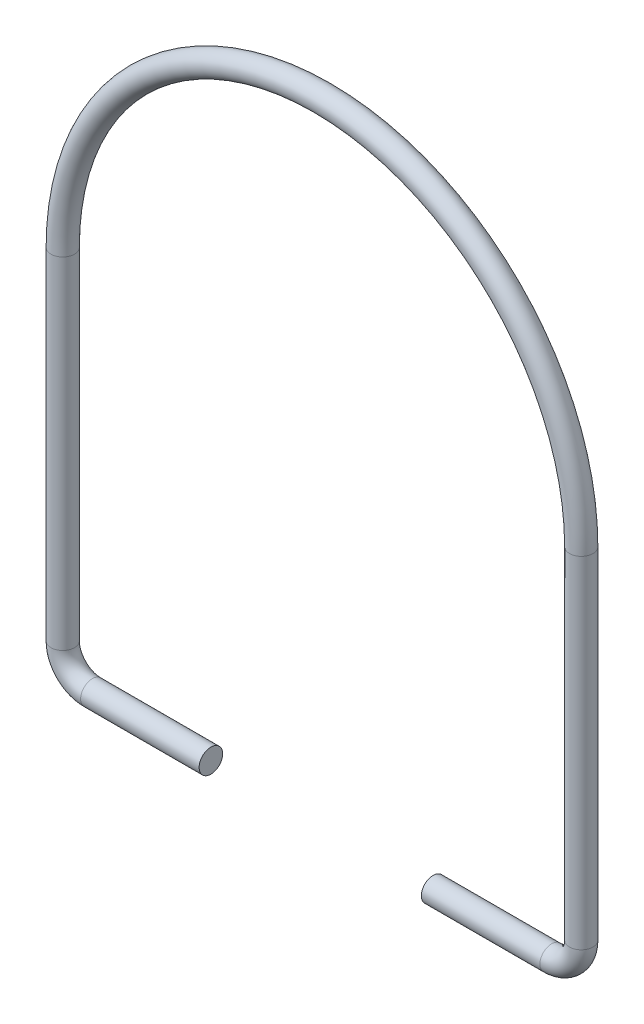
ISO-10303-21;
HEADER;
FILE_DESCRIPTION(('STEP AP214'),'2;1');
FILE_NAME('part.step','',(''),(''),'','','');
FILE_SCHEMA(('AUTOMOTIVE_DESIGN { 1 0 10303 214 1 1 1 1 }'));
ENDSEC;
DATA;
#1=APPLICATION_CONTEXT('core data for automotive mechanical design processes');
#2=APPLICATION_PROTOCOL_DEFINITION('international standard','automotive_design',2000,#1);
#3=PRODUCT_CONTEXT('',#1,'mechanical');
#4=PRODUCT('Part','Part','',(#3));
#5=PRODUCT_RELATED_PRODUCT_CATEGORY('part','',(#4));
#6=PRODUCT_DEFINITION_FORMATION('','',#4);
#7=PRODUCT_DEFINITION_CONTEXT('part definition',#1,'design');
#8=PRODUCT_DEFINITION('design','',#6,#7);
#9=PRODUCT_DEFINITION_SHAPE('','',#8);
#10=(LENGTH_UNIT() NAMED_UNIT(*) SI_UNIT(.MILLI.,.METRE.));
#11=(NAMED_UNIT(*) PLANE_ANGLE_UNIT() SI_UNIT($,.RADIAN.));
#12=(NAMED_UNIT(*) SI_UNIT($,.STERADIAN.) SOLID_ANGLE_UNIT());
#13=UNCERTAINTY_MEASURE_WITH_UNIT(LENGTH_MEASURE(1.E-05),#10,'distance_accuracy_value','');
#14=(GEOMETRIC_REPRESENTATION_CONTEXT(3) GLOBAL_UNCERTAINTY_ASSIGNED_CONTEXT((#13)) GLOBAL_UNIT_ASSIGNED_CONTEXT((#10,
#11,#12)) REPRESENTATION_CONTEXT('',''));
#15=CARTESIAN_POINT('',(0.,0.,0.));
#16=DIRECTION('',(0.,0.,1.));
#17=DIRECTION('',(1.,0.,0.));
#18=AXIS2_PLACEMENT_3D('',#15,#16,#17);
#19=CARTESIAN_POINT('',(46.,0.,0.));
#20=DIRECTION('',(-1.,0.,0.));
#21=DIRECTION('',(0.,-1.,0.));
#22=AXIS2_PLACEMENT_3D('',#19,#20,#21);
#23=CYLINDRICAL_SURFACE('',#22,1.5875);
#24=CARTESIAN_POINT('',(46.,0.,0.));
#25=DIRECTION('',(1.,0.,0.));
#26=DIRECTION('',(0.,0.,-1.));
#27=AXIS2_PLACEMENT_3D('',#24,#25,#26);
#28=CIRCLE('',#27,1.5875);
#29=CARTESIAN_POINT('',(46.,-1.58750000000001,0.));
#30=VERTEX_POINT('',#29);
#31=EDGE_CURVE('E38',#30,#30,#28,.T.);
#32=ORIENTED_EDGE('',*,*,#31,.F.);
#33=EDGE_LOOP('',(#32));
#34=FACE_BOUND('',#33,.T.);
#35=CARTESIAN_POINT('',(30.,0.,0.));
#36=DIRECTION('',(1.,0.,0.));
#37=DIRECTION('',(0.,0.,-1.));
#38=AXIS2_PLACEMENT_3D('',#35,#36,#37);
#39=CIRCLE('',#38,1.5875);
#40=CARTESIAN_POINT('',(30.,0.,-1.5875));
#41=VERTEX_POINT('',#40);
#42=EDGE_CURVE('E10',#41,#41,#39,.T.);
#43=ORIENTED_EDGE('',*,*,#42,.T.);
#44=EDGE_LOOP('',(#43));
#45=FACE_BOUND('',#44,.T.);
#46=ADVANCED_FACE('F32',(#34,#45),#23,.T.);
#47=CARTESIAN_POINT('',(46.,4.,0.));
#48=DIRECTION('',(0.,0.,-1.));
#49=DIRECTION('',(-1.,0.,0.));
#50=AXIS2_PLACEMENT_3D('',#47,#48,#49);
#51=TOROIDAL_SURFACE('',#50,4.00000000000002,1.5875);
#52=CARTESIAN_POINT('',(50.,4.,0.));
#53=DIRECTION('',(0.,1.,0.));
#54=DIRECTION('',(0.,0.,-1.));
#55=AXIS2_PLACEMENT_3D('',#52,#53,#54);
#56=CIRCLE('',#55,1.5875);
#57=CARTESIAN_POINT('',(51.5875,4.,0.));
#58=VERTEX_POINT('',#57);
#59=EDGE_CURVE('E42',#58,#58,#56,.T.);
#60=CARTESIAN_POINT('',(46.,4.,0.));
#61=DIRECTION('',(0.,0.,-1.));
#62=DIRECTION('',(-1.,0.,0.));
#63=AXIS2_PLACEMENT_3D('',#60,#61,#62);
#64=CIRCLE('',#63,5.58750000000002);
#65=EDGE_CURVE('',#58,#30,#64,.T.);
#66=ORIENTED_EDGE('',*,*,#59,.F.);
#67=ORIENTED_EDGE('',*,*,#31,.T.);
#68=ORIENTED_EDGE('',*,*,#65,.T.);
#69=ORIENTED_EDGE('',*,*,#65,.F.);
#70=EDGE_LOOP('',(#66,#68,#67,#69));
#71=FACE_BOUND('',#70,.T.);
#72=ADVANCED_FACE('F88',(#71),#51,.T.);
#73=CARTESIAN_POINT('',(50.,50.,0.));
#74=DIRECTION('',(0.,-1.,0.));
#75=DIRECTION('',(1.,0.,0.));
#76=AXIS2_PLACEMENT_3D('',#73,#74,#75);
#77=CYLINDRICAL_SURFACE('',#76,1.5875);
#78=CARTESIAN_POINT('',(50.,50.,0.));
#79=DIRECTION('',(0.,1.,0.));
#80=DIRECTION('',(0.,0.,-1.));
#81=AXIS2_PLACEMENT_3D('',#78,#79,#80);
#82=CIRCLE('',#81,1.5875);
#83=CARTESIAN_POINT('',(51.5875,50.,0.));
#84=VERTEX_POINT('',#83);
#85=EDGE_CURVE('E46',#84,#84,#82,.T.);
#86=ORIENTED_EDGE('',*,*,#85,.F.);
#87=EDGE_LOOP('',(#86));
#88=FACE_BOUND('',#87,.T.);
#89=ORIENTED_EDGE('',*,*,#59,.T.);
#90=EDGE_LOOP('',(#89));
#91=FACE_BOUND('',#90,.T.);
#92=ADVANCED_FACE('F82',(#88,#91),#77,.T.);
#93=CARTESIAN_POINT('',(15.,50.,0.));
#94=DIRECTION('',(0.,0.,-1.));
#95=DIRECTION('',(-1.,0.,0.));
#96=AXIS2_PLACEMENT_3D('',#93,#94,#95);
#97=TOROIDAL_SURFACE('',#96,35.,1.5875);
#98=CARTESIAN_POINT('',(-20.,50.,0.));
#99=DIRECTION('',(0.,-1.,0.));
#100=DIRECTION('',(0.,0.,-1.));
#101=AXIS2_PLACEMENT_3D('',#98,#99,#100);
#102=CIRCLE('',#101,1.5875);
#103=CARTESIAN_POINT('',(-21.5875,50.,0.));
#104=VERTEX_POINT('',#103);
#105=EDGE_CURVE('E51',#104,#104,#102,.T.);
#106=CARTESIAN_POINT('',(15.,50.,0.));
#107=DIRECTION('',(0.,0.,-1.));
#108=DIRECTION('',(-1.,0.,0.));
#109=AXIS2_PLACEMENT_3D('',#106,#107,#108);
#110=CIRCLE('',#109,36.5875);
#111=EDGE_CURVE('',#104,#84,#110,.T.);
#112=ORIENTED_EDGE('',*,*,#105,.F.);
#113=ORIENTED_EDGE('',*,*,#85,.T.);
#114=ORIENTED_EDGE('',*,*,#111,.T.);
#115=ORIENTED_EDGE('',*,*,#111,.F.);
#116=EDGE_LOOP('',(#112,#114,#113,#115));
#117=FACE_BOUND('',#116,.T.);
#118=ADVANCED_FACE('F76',(#117),#97,.T.);
#119=CARTESIAN_POINT('',(-20.,4.,0.));
#120=DIRECTION('',(0.,1.,0.));
#121=DIRECTION('',(-1.,0.,0.));
#122=AXIS2_PLACEMENT_3D('',#119,#120,#121);
#123=CYLINDRICAL_SURFACE('',#122,1.5875);
#124=CARTESIAN_POINT('',(-20.,4.,0.));
#125=DIRECTION('',(0.,-1.,0.));
#126=DIRECTION('',(0.,0.,-1.));
#127=AXIS2_PLACEMENT_3D('',#124,#125,#126);
#128=CIRCLE('',#127,1.5875);
#129=CARTESIAN_POINT('',(-21.5875,4.,0.));
#130=VERTEX_POINT('',#129);
#131=EDGE_CURVE('E54',#130,#130,#128,.T.);
#132=ORIENTED_EDGE('',*,*,#131,.F.);
#133=EDGE_LOOP('',(#132));
#134=FACE_BOUND('',#133,.T.);
#135=ORIENTED_EDGE('',*,*,#105,.T.);
#136=EDGE_LOOP('',(#135));
#137=FACE_BOUND('',#136,.T.);
#138=ADVANCED_FACE('F70',(#134,#137),#123,.T.);
#139=CARTESIAN_POINT('',(-16.,4.,0.));
#140=DIRECTION('',(0.,0.,-1.));
#141=DIRECTION('',(-1.,0.,0.));
#142=AXIS2_PLACEMENT_3D('',#139,#140,#141);
#143=TOROIDAL_SURFACE('',#142,4.,1.5875);
#144=CARTESIAN_POINT('',(-16.,0.,0.));
#145=DIRECTION('',(1.,0.,0.));
#146=DIRECTION('',(0.,0.,-1.));
#147=AXIS2_PLACEMENT_3D('',#144,#145,#146);
#148=CIRCLE('',#147,1.5875);
#149=CARTESIAN_POINT('',(-16.,-1.5875,0.));
#150=VERTEX_POINT('',#149);
#151=EDGE_CURVE('E57',#150,#150,#148,.T.);
#152=CARTESIAN_POINT('',(-16.,4.,0.));
#153=DIRECTION('',(0.,0.,-1.));
#154=DIRECTION('',(-1.,0.,0.));
#155=AXIS2_PLACEMENT_3D('',#152,#153,#154);
#156=CIRCLE('',#155,5.5875);
#157=EDGE_CURVE('',#150,#130,#156,.T.);
#158=ORIENTED_EDGE('',*,*,#151,.F.);
#159=ORIENTED_EDGE('',*,*,#131,.T.);
#160=ORIENTED_EDGE('',*,*,#157,.T.);
#161=ORIENTED_EDGE('',*,*,#157,.F.);
#162=EDGE_LOOP('',(#158,#160,#159,#161));
#163=FACE_BOUND('',#162,.T.);
#164=ADVANCED_FACE('F67',(#163),#143,.T.);
#165=CARTESIAN_POINT('',(-16.,0.,0.));
#166=DIRECTION('',(1.,0.,0.));
#167=DIRECTION('',(0.,1.,0.));
#168=AXIS2_PLACEMENT_3D('',#165,#166,#167);
#169=CYLINDRICAL_SURFACE('',#168,1.5875);
#170=ORIENTED_EDGE('',*,*,#151,.T.);
#171=EDGE_LOOP('',(#170));
#172=FACE_BOUND('',#171,.T.);
#173=CARTESIAN_POINT('',(0.,0.,0.));
#174=DIRECTION('',(1.,0.,0.));
#175=DIRECTION('',(0.,0.,-1.));
#176=AXIS2_PLACEMENT_3D('',#173,#174,#175);
#177=CIRCLE('',#176,1.5875);
#178=CARTESIAN_POINT('',(0.,0.,-1.5875));
#179=VERTEX_POINT('',#178);
#180=EDGE_CURVE('E58',#179,#179,#177,.T.);
#181=ORIENTED_EDGE('',*,*,#180,.F.);
#182=EDGE_LOOP('',(#181));
#183=FACE_BOUND('',#182,.T.);
#184=ADVANCED_FACE('F64',(#172,#183),#169,.T.);
#185=CARTESIAN_POINT('',(30.,0.,0.));
#186=DIRECTION('',(1.,0.,0.));
#187=DIRECTION('',(0.,0.,-1.));
#188=AXIS2_PLACEMENT_3D('',#185,#186,#187);
#189=PLANE('',#188);
#190=ORIENTED_EDGE('',*,*,#42,.F.);
#191=EDGE_LOOP('',(#190));
#192=FACE_BOUND('',#191,.T.);
#193=ADVANCED_FACE('F100',(#192),#189,.F.);
#194=CARTESIAN_POINT('',(0.,0.,0.));
#195=DIRECTION('',(1.,0.,0.));
#196=DIRECTION('',(0.,0.,-1.));
#197=AXIS2_PLACEMENT_3D('',#194,#195,#196);
#198=PLANE('',#197);
#199=ORIENTED_EDGE('',*,*,#180,.T.);
#200=EDGE_LOOP('',(#199));
#201=FACE_BOUND('',#200,.T.);
#202=ADVANCED_FACE('F101',(#201),#198,.T.);
#203=CLOSED_SHELL('',(#46,#72,#92,#118,#138,#164,#184,#193,#202));
#204=MANIFOLD_SOLID_BREP('B2',#203);
#205=ADVANCED_BREP_SHAPE_REPRESENTATION('',(#18,#204),#14);
#206=SHAPE_DEFINITION_REPRESENTATION(#9,#205);
ENDSEC;
END-ISO-10303-21;
